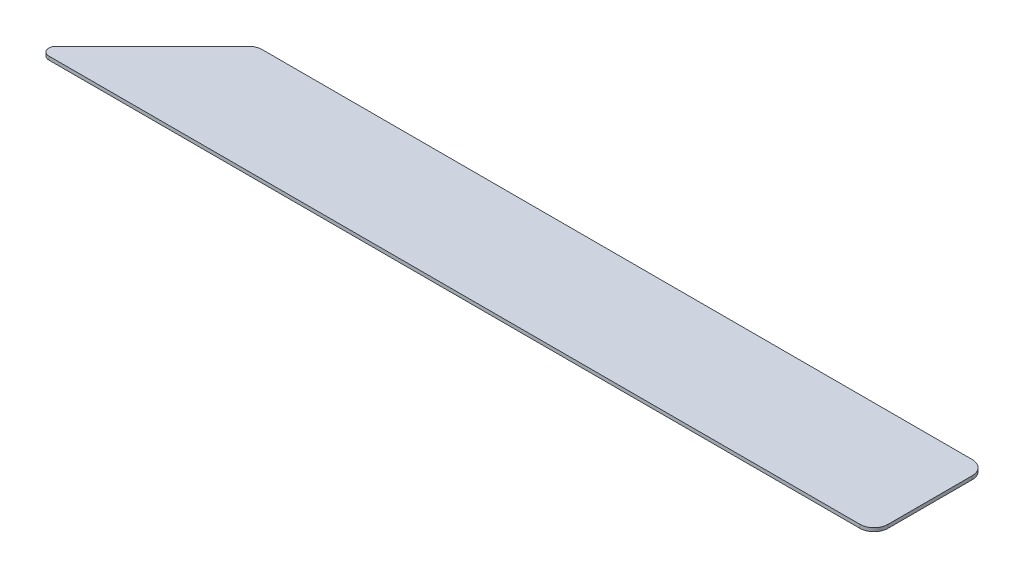
ISO-10303-21;
HEADER;
FILE_DESCRIPTION(('STEP AP214'),'2;1');
FILE_NAME('part.step','',(''),(''),'','','');
FILE_SCHEMA(('AUTOMOTIVE_DESIGN { 1 0 10303 214 1 1 1 1 }'));
ENDSEC;
DATA;
#1=APPLICATION_CONTEXT('core data for automotive mechanical design processes');
#2=APPLICATION_PROTOCOL_DEFINITION('international standard','automotive_design',2000,#1);
#3=PRODUCT_CONTEXT('',#1,'mechanical');
#4=PRODUCT('Part','Part','',(#3));
#5=PRODUCT_RELATED_PRODUCT_CATEGORY('part','',(#4));
#6=PRODUCT_DEFINITION_FORMATION('','',#4);
#7=PRODUCT_DEFINITION_CONTEXT('part definition',#1,'design');
#8=PRODUCT_DEFINITION('design','',#6,#7);
#9=PRODUCT_DEFINITION_SHAPE('','',#8);
#10=(LENGTH_UNIT() NAMED_UNIT(*) SI_UNIT(.MILLI.,.METRE.));
#11=(NAMED_UNIT(*) PLANE_ANGLE_UNIT() SI_UNIT($,.RADIAN.));
#12=(NAMED_UNIT(*) SI_UNIT($,.STERADIAN.) SOLID_ANGLE_UNIT());
#13=UNCERTAINTY_MEASURE_WITH_UNIT(LENGTH_MEASURE(1.E-05),#10,'distance_accuracy_value','');
#14=(GEOMETRIC_REPRESENTATION_CONTEXT(3) GLOBAL_UNCERTAINTY_ASSIGNED_CONTEXT((#13)) GLOBAL_UNIT_ASSIGNED_CONTEXT((#10,
#11,#12)) REPRESENTATION_CONTEXT('',''));
#15=CARTESIAN_POINT('',(0.,0.,0.));
#16=DIRECTION('',(0.,0.,1.));
#17=DIRECTION('',(1.,0.,0.));
#18=AXIS2_PLACEMENT_3D('',#15,#16,#17);
#19=CARTESIAN_POINT('',(374.65,1.5875,-44.45));
#20=DIRECTION('',(0.,-1.,0.));
#21=DIRECTION('',(0.,0.,-1.));
#22=AXIS2_PLACEMENT_3D('',#19,#20,#21);
#23=CYLINDRICAL_SURFACE('',#22,6.35000000000001);
#24=CARTESIAN_POINT('',(374.65,0.,-44.45));
#25=DIRECTION('',(0.,1.,0.));
#26=DIRECTION('',(0.,0.,1.));
#27=AXIS2_PLACEMENT_3D('',#24,#25,#26);
#28=CIRCLE('',#27,6.35000000000001);
#29=CARTESIAN_POINT('',(381.,0.,-44.45));
#30=VERTEX_POINT('',#29);
#31=CARTESIAN_POINT('',(374.65,0.,-50.8));
#32=VERTEX_POINT('',#31);
#33=EDGE_CURVE('E142',#30,#32,#28,.T.);
#34=ORIENTED_EDGE('',*,*,#33,.T.);
#35=DIRECTION('',(0.,-1.,0.));
#36=VECTOR('',#35,1.);
#37=CARTESIAN_POINT('',(374.65,1.5875,-50.8));
#38=LINE('',#37,#36);
#39=CARTESIAN_POINT('',(374.65,1.5875,-50.8));
#40=VERTEX_POINT('',#39);
#41=EDGE_CURVE('E11',#40,#32,#38,.T.);
#42=ORIENTED_EDGE('',*,*,#41,.F.);
#43=CARTESIAN_POINT('',(374.65,1.5875,-44.45));
#44=DIRECTION('',(0.,1.,0.));
#45=DIRECTION('',(0.,0.,1.));
#46=AXIS2_PLACEMENT_3D('',#43,#44,#45);
#47=CIRCLE('',#46,6.35000000000001);
#48=CARTESIAN_POINT('',(381.,1.5875,-44.45));
#49=VERTEX_POINT('',#48);
#50=EDGE_CURVE('E164',#49,#40,#47,.T.);
#51=ORIENTED_EDGE('',*,*,#50,.F.);
#52=DIRECTION('',(0.,-1.,0.));
#53=VECTOR('',#52,1.);
#54=CARTESIAN_POINT('',(381.,1.5875,-44.45));
#55=LINE('',#54,#53);
#56=EDGE_CURVE('E138',#49,#30,#55,.T.);
#57=ORIENTED_EDGE('',*,*,#56,.T.);
#58=EDGE_LOOP('',(#34,#42,#51,#57));
#59=FACE_BOUND('',#58,.T.);
#60=ADVANCED_FACE('F41',(#59),#23,.T.);
#61=CARTESIAN_POINT('',(374.65,1.5875,-50.8));
#62=DIRECTION('',(0.,0.,1.));
#63=DIRECTION('',(1.,0.,0.));
#64=AXIS2_PLACEMENT_3D('',#61,#62,#63);
#65=PLANE('',#64);
#66=DIRECTION('',(-1.,0.,0.));
#67=VECTOR('',#66,1.);
#68=CARTESIAN_POINT('',(374.65,0.,-50.8));
#69=LINE('',#68,#67);
#70=CARTESIAN_POINT('',(53.4302561210692,0.,-50.8));
#71=VERTEX_POINT('',#70);
#72=EDGE_CURVE('E146',#32,#71,#69,.T.);
#73=ORIENTED_EDGE('',*,*,#72,.T.);
#74=DIRECTION('',(0.,-1.,0.));
#75=VECTOR('',#74,1.);
#76=CARTESIAN_POINT('',(53.4302561210692,1.5875,-50.8));
#77=LINE('',#76,#75);
#78=CARTESIAN_POINT('',(53.4302561210692,1.5875,-50.8));
#79=VERTEX_POINT('',#78);
#80=EDGE_CURVE('E50',#79,#71,#77,.T.);
#81=ORIENTED_EDGE('',*,*,#80,.F.);
#82=DIRECTION('',(-1.,0.,0.));
#83=VECTOR('',#82,1.);
#84=CARTESIAN_POINT('',(374.65,1.5875,-50.8));
#85=LINE('',#84,#83);
#86=EDGE_CURVE('E101',#40,#79,#85,.T.);
#87=ORIENTED_EDGE('',*,*,#86,.F.);
#88=ORIENTED_EDGE('',*,*,#41,.T.);
#89=EDGE_LOOP('',(#73,#81,#87,#88));
#90=FACE_BOUND('',#89,.T.);
#91=ADVANCED_FACE('F210',(#90),#65,.F.);
#92=CARTESIAN_POINT('',(53.4302561210692,1.5875,-44.45));
#93=DIRECTION('',(0.,-1.,0.));
#94=DIRECTION('',(0.,0.,-1.));
#95=AXIS2_PLACEMENT_3D('',#92,#93,#94);
#96=CYLINDRICAL_SURFACE('',#95,6.35);
#97=CARTESIAN_POINT('',(53.4302561210692,0.,-44.45));
#98=DIRECTION('',(0.,1.,0.));
#99=DIRECTION('',(0.,0.,1.));
#100=AXIS2_PLACEMENT_3D('',#97,#98,#99);
#101=CIRCLE('',#100,6.35);
#102=CARTESIAN_POINT('',(48.9401280605346,0.,-48.9401280605345));
#103=VERTEX_POINT('',#102);
#104=EDGE_CURVE('E149',#71,#103,#101,.T.);
#105=ORIENTED_EDGE('',*,*,#104,.T.);
#106=DIRECTION('',(0.,-1.,0.));
#107=VECTOR('',#106,1.);
#108=CARTESIAN_POINT('',(48.9401280605346,1.5875,-48.9401280605345));
#109=LINE('',#108,#107);
#110=CARTESIAN_POINT('',(48.9401280605346,1.5875,-48.9401280605345));
#111=VERTEX_POINT('',#110);
#112=EDGE_CURVE('E175',#111,#103,#109,.T.);
#113=ORIENTED_EDGE('',*,*,#112,.F.);
#114=CARTESIAN_POINT('',(53.4302561210692,1.5875,-44.45));
#115=DIRECTION('',(0.,1.,0.));
#116=DIRECTION('',(0.,0.,1.));
#117=AXIS2_PLACEMENT_3D('',#114,#115,#116);
#118=CIRCLE('',#117,6.35);
#119=EDGE_CURVE('E185',#79,#111,#118,.T.);
#120=ORIENTED_EDGE('',*,*,#119,.F.);
#121=ORIENTED_EDGE('',*,*,#80,.T.);
#122=EDGE_LOOP('',(#105,#113,#120,#121));
#123=FACE_BOUND('',#122,.T.);
#124=ADVANCED_FACE('F183',(#123),#96,.T.);
#125=CARTESIAN_POINT('',(48.9401280605346,1.5875,-48.9401280605345));
#126=DIRECTION('',(0.707106781186547,0.,0.707106781186548));
#127=DIRECTION('',(0.707106781186548,0.,-0.707106781186547));
#128=AXIS2_PLACEMENT_3D('',#125,#126,#127);
#129=PLANE('',#128);
#130=DIRECTION('',(-0.707106781186548,0.,0.707106781186547));
#131=VECTOR('',#130,1.);
#132=CARTESIAN_POINT('',(48.9401280605346,0.,-48.9401280605345));
#133=LINE('',#132,#131);
#134=CARTESIAN_POINT('',(5.42006403026735,0.,-5.42006403026734));
#135=VERTEX_POINT('',#134);
#136=EDGE_CURVE('E152',#103,#135,#133,.T.);
#137=ORIENTED_EDGE('',*,*,#136,.T.);
#138=DIRECTION('',(0.,-1.,0.));
#139=VECTOR('',#138,1.);
#140=CARTESIAN_POINT('',(5.42006403026735,1.5875,-5.42006403026734));
#141=LINE('',#140,#139);
#142=CARTESIAN_POINT('',(5.42006403026735,1.5875,-5.42006403026734));
#143=VERTEX_POINT('',#142);
#144=EDGE_CURVE('E171',#143,#135,#141,.T.);
#145=ORIENTED_EDGE('',*,*,#144,.F.);
#146=DIRECTION('',(-0.707106781186548,0.,0.707106781186547));
#147=VECTOR('',#146,1.);
#148=CARTESIAN_POINT('',(48.9401280605346,1.5875,-48.9401280605345));
#149=LINE('',#148,#147);
#150=EDGE_CURVE('E198',#111,#143,#149,.T.);
#151=ORIENTED_EDGE('',*,*,#150,.F.);
#152=ORIENTED_EDGE('',*,*,#112,.T.);
#153=EDGE_LOOP('',(#137,#145,#151,#152));
#154=FACE_BOUND('',#153,.T.);
#155=ADVANCED_FACE('F193',(#154),#129,.F.);
#156=CARTESIAN_POINT('',(7.66512806053458,1.5875,-3.175));
#157=DIRECTION('',(0.,-1.,0.));
#158=DIRECTION('',(0.,0.,-1.));
#159=AXIS2_PLACEMENT_3D('',#156,#157,#158);
#160=CYLINDRICAL_SURFACE('',#159,3.175);
#161=CARTESIAN_POINT('',(7.66512806053458,0.,-3.175));
#162=DIRECTION('',(0.,1.,0.));
#163=DIRECTION('',(0.,0.,-1.));
#164=AXIS2_PLACEMENT_3D('',#161,#162,#163);
#165=CIRCLE('',#164,3.175);
#166=CARTESIAN_POINT('',(7.66512806053466,0.,0.));
#167=VERTEX_POINT('',#166);
#168=EDGE_CURVE('E155',#135,#167,#165,.T.);
#169=ORIENTED_EDGE('',*,*,#168,.T.);
#170=DIRECTION('',(0.,-1.,0.));
#171=VECTOR('',#170,1.);
#172=CARTESIAN_POINT('',(7.66512806053466,1.5875,0.));
#173=LINE('',#172,#171);
#174=CARTESIAN_POINT('',(7.66512806053466,1.5875,0.));
#175=VERTEX_POINT('',#174);
#176=EDGE_CURVE('E131',#175,#167,#173,.T.);
#177=ORIENTED_EDGE('',*,*,#176,.F.);
#178=CARTESIAN_POINT('',(7.66512806053458,1.5875,-3.175));
#179=DIRECTION('',(0.,1.,0.));
#180=DIRECTION('',(0.,0.,-1.));
#181=AXIS2_PLACEMENT_3D('',#178,#179,#180);
#182=CIRCLE('',#181,3.175);
#183=EDGE_CURVE('E120',#143,#175,#182,.T.);
#184=ORIENTED_EDGE('',*,*,#183,.F.);
#185=ORIENTED_EDGE('',*,*,#144,.T.);
#186=EDGE_LOOP('',(#169,#177,#184,#185));
#187=FACE_BOUND('',#186,.T.);
#188=ADVANCED_FACE('F196',(#187),#160,.T.);
#189=CARTESIAN_POINT('',(7.66512806053466,1.5875,0.));
#190=DIRECTION('',(0.,0.,-1.));
#191=DIRECTION('',(-1.,0.,0.));
#192=AXIS2_PLACEMENT_3D('',#189,#190,#191);
#193=PLANE('',#192);
#194=DIRECTION('',(1.,0.,0.));
#195=VECTOR('',#194,1.);
#196=CARTESIAN_POINT('',(7.66512806053466,0.,0.));
#197=LINE('',#196,#195);
#198=CARTESIAN_POINT('',(374.65,0.,0.));
#199=VERTEX_POINT('',#198);
#200=EDGE_CURVE('E129',#167,#199,#197,.T.);
#201=ORIENTED_EDGE('',*,*,#200,.T.);
#202=DIRECTION('',(0.,-1.,0.));
#203=VECTOR('',#202,1.);
#204=CARTESIAN_POINT('',(374.65,1.5875,0.));
#205=LINE('',#204,#203);
#206=CARTESIAN_POINT('',(374.65,1.5875,0.));
#207=VERTEX_POINT('',#206);
#208=EDGE_CURVE('E126',#207,#199,#205,.T.);
#209=ORIENTED_EDGE('',*,*,#208,.F.);
#210=DIRECTION('',(1.,0.,0.));
#211=VECTOR('',#210,1.);
#212=CARTESIAN_POINT('',(7.66512806053466,1.5875,0.));
#213=LINE('',#212,#211);
#214=EDGE_CURVE('E114',#175,#207,#213,.T.);
#215=ORIENTED_EDGE('',*,*,#214,.F.);
#216=ORIENTED_EDGE('',*,*,#176,.T.);
#217=EDGE_LOOP('',(#201,#209,#215,#216));
#218=FACE_BOUND('',#217,.T.);
#219=ADVANCED_FACE('F127',(#218),#193,.F.);
#220=CARTESIAN_POINT('',(374.65,1.5875,-6.35));
#221=DIRECTION('',(0.,-1.,0.));
#222=DIRECTION('',(0.,0.,-1.));
#223=AXIS2_PLACEMENT_3D('',#220,#221,#222);
#224=CYLINDRICAL_SURFACE('',#223,6.35000000000001);
#225=CARTESIAN_POINT('',(374.65,0.,-6.35));
#226=DIRECTION('',(0.,1.,0.));
#227=DIRECTION('',(0.,0.,-1.));
#228=AXIS2_PLACEMENT_3D('',#225,#226,#227);
#229=CIRCLE('',#228,6.35000000000001);
#230=CARTESIAN_POINT('',(381.,0.,-6.35000000000004));
#231=VERTEX_POINT('',#230);
#232=EDGE_CURVE('E87',#199,#231,#229,.T.);
#233=ORIENTED_EDGE('',*,*,#232,.T.);
#234=DIRECTION('',(0.,-1.,0.));
#235=VECTOR('',#234,1.);
#236=CARTESIAN_POINT('',(381.,1.5875,-6.35000000000004));
#237=LINE('',#236,#235);
#238=CARTESIAN_POINT('',(381.,1.5875,-6.35000000000004));
#239=VERTEX_POINT('',#238);
#240=EDGE_CURVE('E132',#239,#231,#237,.T.);
#241=ORIENTED_EDGE('',*,*,#240,.F.);
#242=CARTESIAN_POINT('',(374.65,1.5875,-6.35));
#243=DIRECTION('',(0.,1.,0.));
#244=DIRECTION('',(0.,0.,-1.));
#245=AXIS2_PLACEMENT_3D('',#242,#243,#244);
#246=CIRCLE('',#245,6.35000000000001);
#247=EDGE_CURVE('E118',#207,#239,#246,.T.);
#248=ORIENTED_EDGE('',*,*,#247,.F.);
#249=ORIENTED_EDGE('',*,*,#208,.T.);
#250=EDGE_LOOP('',(#233,#241,#248,#249));
#251=FACE_BOUND('',#250,.T.);
#252=ADVANCED_FACE('F134',(#251),#224,.T.);
#253=CARTESIAN_POINT('',(381.,1.5875,-6.35000000000004));
#254=DIRECTION('',(-1.,0.,0.));
#255=DIRECTION('',(0.,0.,1.));
#256=AXIS2_PLACEMENT_3D('',#253,#254,#255);
#257=PLANE('',#256);
#258=DIRECTION('',(0.,0.,-1.));
#259=VECTOR('',#258,1.);
#260=CARTESIAN_POINT('',(381.,0.,-6.35000000000004));
#261=LINE('',#260,#259);
#262=EDGE_CURVE('E93',#231,#30,#261,.T.);
#263=ORIENTED_EDGE('',*,*,#262,.T.);
#264=ORIENTED_EDGE('',*,*,#56,.F.);
#265=DIRECTION('',(0.,0.,-1.));
#266=VECTOR('',#265,1.);
#267=CARTESIAN_POINT('',(381.,1.5875,-6.35000000000004));
#268=LINE('',#267,#266);
#269=EDGE_CURVE('E58',#239,#49,#268,.T.);
#270=ORIENTED_EDGE('',*,*,#269,.F.);
#271=ORIENTED_EDGE('',*,*,#240,.T.);
#272=EDGE_LOOP('',(#263,#264,#270,#271));
#273=FACE_BOUND('',#272,.T.);
#274=ADVANCED_FACE('F226',(#273),#257,.F.);
#275=CARTESIAN_POINT('',(374.65,1.5875,-44.45));
#276=DIRECTION('',(0.,1.,0.));
#277=DIRECTION('',(0.,0.,1.));
#278=AXIS2_PLACEMENT_3D('',#275,#276,#277);
#279=PLANE('',#278);
#280=ORIENTED_EDGE('',*,*,#50,.T.);
#281=ORIENTED_EDGE('',*,*,#86,.T.);
#282=ORIENTED_EDGE('',*,*,#119,.T.);
#283=ORIENTED_EDGE('',*,*,#150,.T.);
#284=ORIENTED_EDGE('',*,*,#183,.T.);
#285=ORIENTED_EDGE('',*,*,#214,.T.);
#286=ORIENTED_EDGE('',*,*,#247,.T.);
#287=ORIENTED_EDGE('',*,*,#269,.T.);
#288=EDGE_LOOP('',(#280,#281,#282,#283,#284,#285,#286,#287));
#289=FACE_BOUND('',#288,.T.);
#290=ADVANCED_FACE('F116',(#289),#279,.T.);
#291=CARTESIAN_POINT('',(374.65,0.,-44.45));
#292=DIRECTION('',(0.,1.,0.));
#293=DIRECTION('',(0.,0.,1.));
#294=AXIS2_PLACEMENT_3D('',#291,#292,#293);
#295=PLANE('',#294);
#296=ORIENTED_EDGE('',*,*,#33,.F.);
#297=ORIENTED_EDGE('',*,*,#262,.F.);
#298=ORIENTED_EDGE('',*,*,#232,.F.);
#299=ORIENTED_EDGE('',*,*,#200,.F.);
#300=ORIENTED_EDGE('',*,*,#168,.F.);
#301=ORIENTED_EDGE('',*,*,#136,.F.);
#302=ORIENTED_EDGE('',*,*,#104,.F.);
#303=ORIENTED_EDGE('',*,*,#72,.F.);
#304=EDGE_LOOP('',(#296,#297,#298,#299,#300,#301,#302,#303));
#305=FACE_BOUND('',#304,.T.);
#306=ADVANCED_FACE('F189',(#305),#295,.F.);
#307=CLOSED_SHELL('',(#60,#91,#124,#155,#188,#219,#252,#274,#290,#306));
#308=MANIFOLD_SOLID_BREP('B2',#307);
#309=ADVANCED_BREP_SHAPE_REPRESENTATION('',(#18,#308),#14);
#310=SHAPE_DEFINITION_REPRESENTATION(#9,#309);
ENDSEC;
END-ISO-10303-21;
